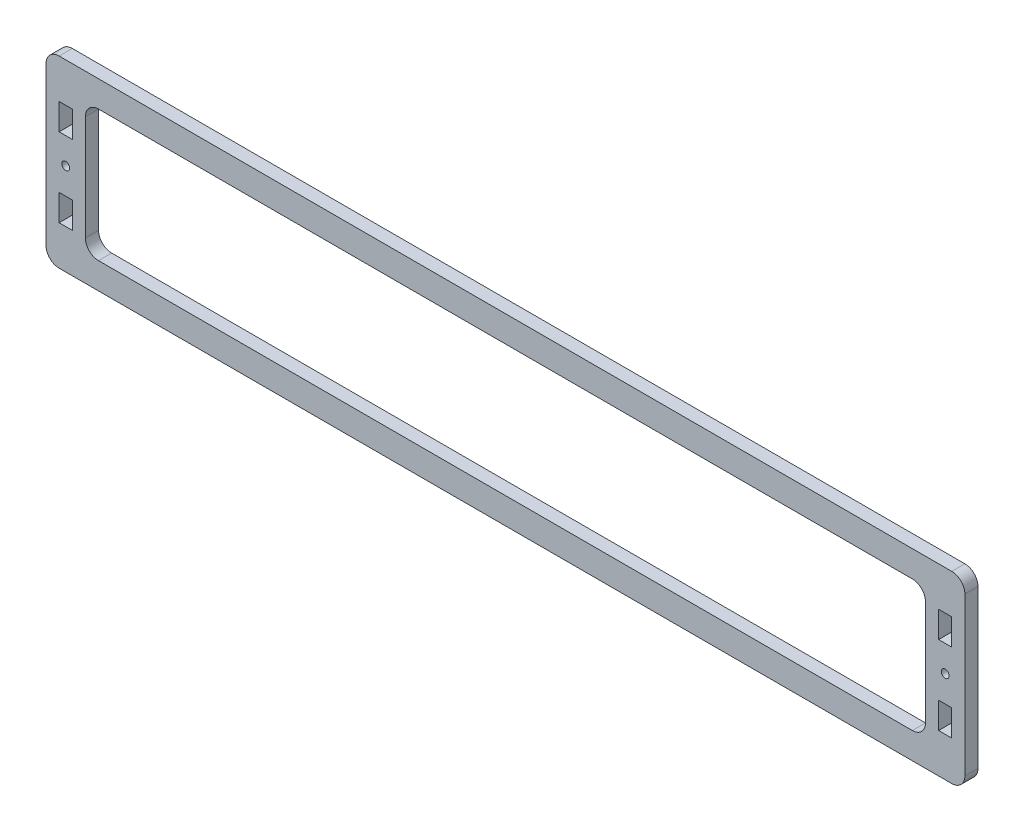
ISO-10303-21;
HEADER;
FILE_DESCRIPTION(('STEP AP214'),'2;1');
FILE_NAME('part.step','',(''),(''),'','','');
FILE_SCHEMA(('AUTOMOTIVE_DESIGN { 1 0 10303 214 1 1 1 1 }'));
ENDSEC;
DATA;
#1=APPLICATION_CONTEXT('core data for automotive mechanical design processes');
#2=APPLICATION_PROTOCOL_DEFINITION('international standard','automotive_design',2000,#1);
#3=PRODUCT_CONTEXT('',#1,'mechanical');
#4=PRODUCT('Part','Part','',(#3));
#5=PRODUCT_RELATED_PRODUCT_CATEGORY('part','',(#4));
#6=PRODUCT_DEFINITION_FORMATION('','',#4);
#7=PRODUCT_DEFINITION_CONTEXT('part definition',#1,'design');
#8=PRODUCT_DEFINITION('design','',#6,#7);
#9=PRODUCT_DEFINITION_SHAPE('','',#8);
#10=(LENGTH_UNIT() NAMED_UNIT(*) SI_UNIT(.MILLI.,.METRE.));
#11=(NAMED_UNIT(*) PLANE_ANGLE_UNIT() SI_UNIT($,.RADIAN.));
#12=(NAMED_UNIT(*) SI_UNIT($,.STERADIAN.) SOLID_ANGLE_UNIT());
#13=UNCERTAINTY_MEASURE_WITH_UNIT(LENGTH_MEASURE(1.E-05),#10,'distance_accuracy_value','');
#14=(GEOMETRIC_REPRESENTATION_CONTEXT(3) GLOBAL_UNCERTAINTY_ASSIGNED_CONTEXT((#13)) GLOBAL_UNIT_ASSIGNED_CONTEXT((#10,
#11,#12)) REPRESENTATION_CONTEXT('',''));
#15=CARTESIAN_POINT('',(0.,0.,0.));
#16=DIRECTION('',(0.,0.,1.));
#17=DIRECTION('',(1.,0.,0.));
#18=AXIS2_PLACEMENT_3D('',#15,#16,#17);
#19=CARTESIAN_POINT('',(0.,0.,5.));
#20=DIRECTION('',(0.,0.,1.));
#21=DIRECTION('',(1.,0.,0.));
#22=AXIS2_PLACEMENT_3D('',#19,#20,#21);
#23=PLANE('',#22);
#24=DIRECTION('',(0.,-1.,0.));
#25=VECTOR('',#24,1.);
#26=CARTESIAN_POINT('',(-70.8132530120482,25.,5.));
#27=LINE('',#26,#25);
#28=CARTESIAN_POINT('',(-70.8132530120482,20.,5.));
#29=VERTEX_POINT('',#28);
#30=CARTESIAN_POINT('',(-70.8132530120482,-20.,5.));
#31=VERTEX_POINT('',#30);
#32=EDGE_CURVE('E524',#29,#31,#27,.T.);
#33=ORIENTED_EDGE('',*,*,#32,.F.);
#34=CARTESIAN_POINT('',(-65.8132530120482,20.,5.));
#35=DIRECTION('',(0.,0.,1.));
#36=DIRECTION('',(1.,0.,0.));
#37=AXIS2_PLACEMENT_3D('',#34,#35,#36);
#38=CIRCLE('',#37,5.);
#39=CARTESIAN_POINT('',(-65.8132530120482,25.,5.));
#40=VERTEX_POINT('',#39);
#41=EDGE_CURVE('E486',#29,#40,#38,.F.);
#42=ORIENTED_EDGE('',*,*,#41,.T.);
#43=DIRECTION('',(-1.,0.,0.));
#44=VECTOR('',#43,1.);
#45=CARTESIAN_POINT('',(-70.8132530120482,25.,5.));
#46=LINE('',#45,#44);
#47=CARTESIAN_POINT('',(244.186746987952,25.,5.));
#48=VERTEX_POINT('',#47);
#49=EDGE_CURVE('E276',#48,#40,#46,.T.);
#50=ORIENTED_EDGE('',*,*,#49,.F.);
#51=CARTESIAN_POINT('',(244.186746987952,20.,5.));
#52=DIRECTION('',(0.,0.,1.));
#53=DIRECTION('',(1.,0.,0.));
#54=AXIS2_PLACEMENT_3D('',#51,#52,#53);
#55=CIRCLE('',#54,5.);
#56=CARTESIAN_POINT('',(249.186746987952,20.,5.));
#57=VERTEX_POINT('',#56);
#58=EDGE_CURVE('E41',#48,#57,#55,.F.);
#59=ORIENTED_EDGE('',*,*,#58,.T.);
#60=DIRECTION('',(0.,1.,0.));
#61=VECTOR('',#60,1.);
#62=CARTESIAN_POINT('',(249.186746987952,25.,5.));
#63=LINE('',#62,#61);
#64=CARTESIAN_POINT('',(249.186746987952,-20.,5.));
#65=VERTEX_POINT('',#64);
#66=EDGE_CURVE('E495',#65,#57,#63,.T.);
#67=ORIENTED_EDGE('',*,*,#66,.F.);
#68=CARTESIAN_POINT('',(244.186746987952,-20.,5.));
#69=DIRECTION('',(0.,0.,1.));
#70=DIRECTION('',(1.,0.,0.));
#71=AXIS2_PLACEMENT_3D('',#68,#69,#70);
#72=CIRCLE('',#71,5.);
#73=CARTESIAN_POINT('',(244.186746987952,-25.,5.));
#74=VERTEX_POINT('',#73);
#75=EDGE_CURVE('E478',#65,#74,#72,.F.);
#76=ORIENTED_EDGE('',*,*,#75,.T.);
#77=DIRECTION('',(1.,0.,0.));
#78=VECTOR('',#77,1.);
#79=CARTESIAN_POINT('',(-70.8132530120482,-25.,5.));
#80=LINE('',#79,#78);
#81=CARTESIAN_POINT('',(-65.8132530120482,-25.,5.));
#82=VERTEX_POINT('',#81);
#83=EDGE_CURVE('E504',#82,#74,#80,.T.);
#84=ORIENTED_EDGE('',*,*,#83,.F.);
#85=CARTESIAN_POINT('',(-65.8132530120482,-20.,5.));
#86=DIRECTION('',(0.,0.,1.));
#87=DIRECTION('',(1.,0.,0.));
#88=AXIS2_PLACEMENT_3D('',#85,#86,#87);
#89=CIRCLE('',#88,5.);
#90=EDGE_CURVE('E482',#82,#31,#89,.F.);
#91=ORIENTED_EDGE('',*,*,#90,.T.);
#92=EDGE_LOOP('',(#33,#42,#50,#59,#67,#76,#84,#91));
#93=FACE_BOUND('',#92,.T.);
#94=DIRECTION('',(0.,1.,0.));
#95=VECTOR('',#94,1.);
#96=CARTESIAN_POINT('',(259.186746987952,-20.,5.));
#97=LINE('',#96,#95);
#98=CARTESIAN_POINT('',(259.186746987952,-20.,5.));
#99=VERTEX_POINT('',#98);
#100=CARTESIAN_POINT('',(259.186746987952,-10.,5.));
#101=VERTEX_POINT('',#100);
#102=EDGE_CURVE('E295',#99,#101,#97,.T.);
#103=ORIENTED_EDGE('',*,*,#102,.F.);
#104=DIRECTION('',(1.,0.,0.));
#105=VECTOR('',#104,1.);
#106=CARTESIAN_POINT('',(259.186746987952,-20.,5.));
#107=LINE('',#106,#105);
#108=CARTESIAN_POINT('',(254.186746987952,-20.,5.));
#109=VERTEX_POINT('',#108);
#110=EDGE_CURVE('E293',#109,#99,#107,.T.);
#111=ORIENTED_EDGE('',*,*,#110,.F.);
#112=DIRECTION('',(0.,-1.,0.));
#113=VECTOR('',#112,1.);
#114=CARTESIAN_POINT('',(254.186746987952,-20.,5.));
#115=LINE('',#114,#113);
#116=CARTESIAN_POINT('',(254.186746987952,-9.99999999999996,5.));
#117=VERTEX_POINT('',#116);
#118=EDGE_CURVE('E301',#117,#109,#115,.T.);
#119=ORIENTED_EDGE('',*,*,#118,.F.);
#120=DIRECTION('',(-1.,0.,0.));
#121=VECTOR('',#120,1.);
#122=CARTESIAN_POINT('',(259.186746987952,-10.,5.));
#123=LINE('',#122,#121);
#124=EDGE_CURVE('E298',#101,#117,#123,.T.);
#125=ORIENTED_EDGE('',*,*,#124,.F.);
#126=EDGE_LOOP('',(#103,#111,#119,#125));
#127=FACE_BOUND('',#126,.T.);
#128=CARTESIAN_POINT('',(-78.3132530120482,0.,5.));
#129=DIRECTION('',(0.,0.,1.));
#130=DIRECTION('',(1.,0.,0.));
#131=AXIS2_PLACEMENT_3D('',#128,#129,#130);
#132=CIRCLE('',#131,1.5);
#133=CARTESIAN_POINT('',(-76.8132530120482,0.,5.));
#134=VERTEX_POINT('',#133);
#135=EDGE_CURVE('E324',#134,#134,#132,.T.);
#136=ORIENTED_EDGE('',*,*,#135,.F.);
#137=EDGE_LOOP('',(#136));
#138=FACE_BOUND('',#137,.T.);
#139=DIRECTION('',(0.,-1.,0.));
#140=VECTOR('',#139,1.);
#141=CARTESIAN_POINT('',(-85.8132530120482,35.,5.));
#142=LINE('',#141,#140);
#143=CARTESIAN_POINT('',(-85.8132530120482,30.,5.));
#144=VERTEX_POINT('',#143);
#145=CARTESIAN_POINT('',(-85.8132530120482,-30.,5.));
#146=VERTEX_POINT('',#145);
#147=EDGE_CURVE('E392',#144,#146,#142,.T.);
#148=ORIENTED_EDGE('',*,*,#147,.T.);
#149=CARTESIAN_POINT('',(-80.8132530120482,-30.,5.));
#150=DIRECTION('',(0.,0.,1.));
#151=DIRECTION('',(1.,0.,0.));
#152=AXIS2_PLACEMENT_3D('',#149,#150,#151);
#153=CIRCLE('',#152,5.);
#154=CARTESIAN_POINT('',(-80.8132530120482,-35.,5.));
#155=VERTEX_POINT('',#154);
#156=EDGE_CURVE('E447',#146,#155,#153,.T.);
#157=ORIENTED_EDGE('',*,*,#156,.T.);
#158=DIRECTION('',(1.,0.,0.));
#159=VECTOR('',#158,1.);
#160=CARTESIAN_POINT('',(-85.8132530120482,-35.,5.));
#161=LINE('',#160,#159);
#162=CARTESIAN_POINT('',(259.186746987952,-35.,5.));
#163=VERTEX_POINT('',#162);
#164=EDGE_CURVE('E395',#155,#163,#161,.T.);
#165=ORIENTED_EDGE('',*,*,#164,.T.);
#166=CARTESIAN_POINT('',(259.186746987952,-30.,5.));
#167=DIRECTION('',(0.,0.,1.));
#168=DIRECTION('',(1.,0.,0.));
#169=AXIS2_PLACEMENT_3D('',#166,#167,#168);
#170=CIRCLE('',#169,5.);
#171=CARTESIAN_POINT('',(264.186746987952,-30.,5.));
#172=VERTEX_POINT('',#171);
#173=EDGE_CURVE('E444',#163,#172,#170,.T.);
#174=ORIENTED_EDGE('',*,*,#173,.T.);
#175=DIRECTION('',(0.,1.,0.));
#176=VECTOR('',#175,1.);
#177=CARTESIAN_POINT('',(264.186746987952,35.,5.));
#178=LINE('',#177,#176);
#179=CARTESIAN_POINT('',(264.186746987952,30.,5.));
#180=VERTEX_POINT('',#179);
#181=EDGE_CURVE('E399',#172,#180,#178,.T.);
#182=ORIENTED_EDGE('',*,*,#181,.T.);
#183=CARTESIAN_POINT('',(259.186746987952,30.,5.));
#184=DIRECTION('',(0.,0.,1.));
#185=DIRECTION('',(1.,0.,0.));
#186=AXIS2_PLACEMENT_3D('',#183,#184,#185);
#187=CIRCLE('',#186,5.);
#188=CARTESIAN_POINT('',(259.186746987952,35.,5.));
#189=VERTEX_POINT('',#188);
#190=EDGE_CURVE('E55',#180,#189,#187,.T.);
#191=ORIENTED_EDGE('',*,*,#190,.T.);
#192=DIRECTION('',(-1.,0.,0.));
#193=VECTOR('',#192,1.);
#194=CARTESIAN_POINT('',(-85.8132530120482,35.,5.));
#195=LINE('',#194,#193);
#196=CARTESIAN_POINT('',(-80.8132530120482,35.,5.));
#197=VERTEX_POINT('',#196);
#198=EDGE_CURVE('E401',#189,#197,#195,.T.);
#199=ORIENTED_EDGE('',*,*,#198,.T.);
#200=CARTESIAN_POINT('',(-80.8132530120482,30.,5.));
#201=DIRECTION('',(0.,0.,1.));
#202=DIRECTION('',(1.,0.,0.));
#203=AXIS2_PLACEMENT_3D('',#200,#201,#202);
#204=CIRCLE('',#203,5.);
#205=EDGE_CURVE('E442',#197,#144,#204,.T.);
#206=ORIENTED_EDGE('',*,*,#205,.T.);
#207=EDGE_LOOP('',(#148,#157,#165,#174,#182,#191,#199,#206));
#208=FACE_BOUND('',#207,.T.);
#209=DIRECTION('',(1.,0.,0.));
#210=VECTOR('',#209,1.);
#211=CARTESIAN_POINT('',(-80.8132530120482,10.,5.));
#212=LINE('',#211,#210);
#213=CARTESIAN_POINT('',(-80.8132530120482,10.,5.));
#214=VERTEX_POINT('',#213);
#215=CARTESIAN_POINT('',(-75.8132530120482,10.,5.));
#216=VERTEX_POINT('',#215);
#217=EDGE_CURVE('E363',#214,#216,#212,.T.);
#218=ORIENTED_EDGE('',*,*,#217,.F.);
#219=DIRECTION('',(0.,-1.,0.));
#220=VECTOR('',#219,1.);
#221=CARTESIAN_POINT('',(-80.8132530120482,20.,5.));
#222=LINE('',#221,#220);
#223=CARTESIAN_POINT('',(-80.8132530120482,20.,5.));
#224=VERTEX_POINT('',#223);
#225=EDGE_CURVE('E361',#224,#214,#222,.T.);
#226=ORIENTED_EDGE('',*,*,#225,.F.);
#227=DIRECTION('',(-1.,0.,0.));
#228=VECTOR('',#227,1.);
#229=CARTESIAN_POINT('',(-80.8132530120482,20.,5.));
#230=LINE('',#229,#228);
#231=CARTESIAN_POINT('',(-75.8132530120482,20.,5.));
#232=VERTEX_POINT('',#231);
#233=EDGE_CURVE('E369',#232,#224,#230,.T.);
#234=ORIENTED_EDGE('',*,*,#233,.F.);
#235=DIRECTION('',(0.,1.,0.));
#236=VECTOR('',#235,1.);
#237=CARTESIAN_POINT('',(-75.8132530120482,20.,5.));
#238=LINE('',#237,#236);
#239=EDGE_CURVE('E366',#216,#232,#238,.T.);
#240=ORIENTED_EDGE('',*,*,#239,.F.);
#241=EDGE_LOOP('',(#218,#226,#234,#240));
#242=FACE_BOUND('',#241,.T.);
#243=DIRECTION('',(1.,0.,0.));
#244=VECTOR('',#243,1.);
#245=CARTESIAN_POINT('',(-80.8132530120482,-20.,5.));
#246=LINE('',#245,#244);
#247=CARTESIAN_POINT('',(-80.8132530120482,-20.,5.));
#248=VERTEX_POINT('',#247);
#249=CARTESIAN_POINT('',(-75.8132530120482,-20.,5.));
#250=VERTEX_POINT('',#249);
#251=EDGE_CURVE('E332',#248,#250,#246,.T.);
#252=ORIENTED_EDGE('',*,*,#251,.F.);
#253=DIRECTION('',(0.,-1.,0.));
#254=VECTOR('',#253,1.);
#255=CARTESIAN_POINT('',(-80.8132530120482,-20.,5.));
#256=LINE('',#255,#254);
#257=CARTESIAN_POINT('',(-80.8132530120482,-10.,5.));
#258=VERTEX_POINT('',#257);
#259=EDGE_CURVE('E330',#258,#248,#256,.T.);
#260=ORIENTED_EDGE('',*,*,#259,.F.);
#261=DIRECTION('',(-1.,0.,0.));
#262=VECTOR('',#261,1.);
#263=CARTESIAN_POINT('',(-80.8132530120482,-10.,5.));
#264=LINE('',#263,#262);
#265=CARTESIAN_POINT('',(-75.8132530120482,-10.,5.));
#266=VERTEX_POINT('',#265);
#267=EDGE_CURVE('E338',#266,#258,#264,.T.);
#268=ORIENTED_EDGE('',*,*,#267,.F.);
#269=DIRECTION('',(0.,1.,0.));
#270=VECTOR('',#269,1.);
#271=CARTESIAN_POINT('',(-75.8132530120482,-20.,5.));
#272=LINE('',#271,#270);
#273=EDGE_CURVE('E335',#250,#266,#272,.T.);
#274=ORIENTED_EDGE('',*,*,#273,.F.);
#275=EDGE_LOOP('',(#252,#260,#268,#274));
#276=FACE_BOUND('',#275,.T.);
#277=CARTESIAN_POINT('',(256.686746987952,0.,5.));
#278=DIRECTION('',(0.,0.,1.));
#279=DIRECTION('',(-1.,0.,0.));
#280=AXIS2_PLACEMENT_3D('',#277,#278,#279);
#281=CIRCLE('',#280,1.50000000000008);
#282=CARTESIAN_POINT('',(255.186746987952,0.,5.));
#283=VERTEX_POINT('',#282);
#284=EDGE_CURVE('E287',#283,#283,#281,.T.);
#285=ORIENTED_EDGE('',*,*,#284,.F.);
#286=EDGE_LOOP('',(#285));
#287=FACE_BOUND('',#286,.T.);
#288=DIRECTION('',(-1.,0.,0.));
#289=VECTOR('',#288,1.);
#290=CARTESIAN_POINT('',(259.186746987952,20.,5.));
#291=LINE('',#290,#289);
#292=CARTESIAN_POINT('',(259.186746987952,20.,5.));
#293=VERTEX_POINT('',#292);
#294=CARTESIAN_POINT('',(254.186746987952,20.,5.));
#295=VERTEX_POINT('',#294);
#296=EDGE_CURVE('E254',#293,#295,#291,.T.);
#297=ORIENTED_EDGE('',*,*,#296,.F.);
#298=DIRECTION('',(0.,1.,0.));
#299=VECTOR('',#298,1.);
#300=CARTESIAN_POINT('',(259.186746987952,20.,5.));
#301=LINE('',#300,#299);
#302=CARTESIAN_POINT('',(259.186746987952,10.,5.));
#303=VERTEX_POINT('',#302);
#304=EDGE_CURVE('E244',#303,#293,#301,.T.);
#305=ORIENTED_EDGE('',*,*,#304,.F.);
#306=DIRECTION('',(1.,0.,0.));
#307=VECTOR('',#306,1.);
#308=CARTESIAN_POINT('',(259.186746987952,10.,5.));
#309=LINE('',#308,#307);
#310=CARTESIAN_POINT('',(254.186746987952,9.99999999999996,5.));
#311=VERTEX_POINT('',#310);
#312=EDGE_CURVE('E269',#311,#303,#309,.T.);
#313=ORIENTED_EDGE('',*,*,#312,.F.);
#314=DIRECTION('',(0.,-1.,0.));
#315=VECTOR('',#314,1.);
#316=CARTESIAN_POINT('',(254.186746987952,20.,5.));
#317=LINE('',#316,#315);
#318=EDGE_CURVE('E267',#295,#311,#317,.T.);
#319=ORIENTED_EDGE('',*,*,#318,.F.);
#320=EDGE_LOOP('',(#297,#305,#313,#319));
#321=FACE_BOUND('',#320,.T.);
#322=ADVANCED_FACE('F33',(#93,#127,#138,#208,#242,#276,#287,#321),#23,.T.);
#323=CARTESIAN_POINT('',(0.,0.,0.));
#324=DIRECTION('',(0.,0.,1.));
#325=DIRECTION('',(1.,0.,0.));
#326=AXIS2_PLACEMENT_3D('',#323,#324,#325);
#327=PLANE('',#326);
#328=DIRECTION('',(0.,1.,0.));
#329=VECTOR('',#328,1.);
#330=CARTESIAN_POINT('',(249.186746987952,0.,0.));
#331=LINE('',#330,#329);
#332=CARTESIAN_POINT('',(249.186746987952,-20.,0.));
#333=VERTEX_POINT('',#332);
#334=CARTESIAN_POINT('',(249.186746987952,20.,0.));
#335=VERTEX_POINT('',#334);
#336=EDGE_CURVE('E415',#333,#335,#331,.T.);
#337=ORIENTED_EDGE('',*,*,#336,.T.);
#338=CARTESIAN_POINT('',(244.186746987952,20.,0.));
#339=DIRECTION('',(0.,0.,1.));
#340=DIRECTION('',(1.,0.,0.));
#341=AXIS2_PLACEMENT_3D('',#338,#339,#340);
#342=CIRCLE('',#341,5.);
#343=CARTESIAN_POINT('',(244.186746987952,25.,0.));
#344=VERTEX_POINT('',#343);
#345=EDGE_CURVE('E11',#335,#344,#342,.T.);
#346=ORIENTED_EDGE('',*,*,#345,.T.);
#347=DIRECTION('',(-1.,0.,0.));
#348=VECTOR('',#347,1.);
#349=CARTESIAN_POINT('',(0.,25.,0.));
#350=LINE('',#349,#348);
#351=CARTESIAN_POINT('',(-65.8132530120482,25.,0.));
#352=VERTEX_POINT('',#351);
#353=EDGE_CURVE('E418',#344,#352,#350,.T.);
#354=ORIENTED_EDGE('',*,*,#353,.T.);
#355=CARTESIAN_POINT('',(-65.8132530120482,20.,0.));
#356=DIRECTION('',(0.,0.,1.));
#357=DIRECTION('',(1.,0.,0.));
#358=AXIS2_PLACEMENT_3D('',#355,#356,#357);
#359=CIRCLE('',#358,5.);
#360=CARTESIAN_POINT('',(-70.8132530120482,20.,0.));
#361=VERTEX_POINT('',#360);
#362=EDGE_CURVE('E488',#352,#361,#359,.T.);
#363=ORIENTED_EDGE('',*,*,#362,.T.);
#364=DIRECTION('',(0.,-1.,0.));
#365=VECTOR('',#364,1.);
#366=CARTESIAN_POINT('',(-70.8132530120482,0.,0.));
#367=LINE('',#366,#365);
#368=CARTESIAN_POINT('',(-70.8132530120482,-20.,0.));
#369=VERTEX_POINT('',#368);
#370=EDGE_CURVE('E421',#361,#369,#367,.T.);
#371=ORIENTED_EDGE('',*,*,#370,.T.);
#372=CARTESIAN_POINT('',(-65.8132530120482,-20.,0.));
#373=DIRECTION('',(0.,0.,1.));
#374=DIRECTION('',(1.,0.,0.));
#375=AXIS2_PLACEMENT_3D('',#372,#373,#374);
#376=CIRCLE('',#375,5.);
#377=CARTESIAN_POINT('',(-65.8132530120482,-25.,0.));
#378=VERTEX_POINT('',#377);
#379=EDGE_CURVE('E484',#369,#378,#376,.T.);
#380=ORIENTED_EDGE('',*,*,#379,.T.);
#381=DIRECTION('',(1.,0.,0.));
#382=VECTOR('',#381,1.);
#383=CARTESIAN_POINT('',(0.,-25.,0.));
#384=LINE('',#383,#382);
#385=CARTESIAN_POINT('',(244.186746987952,-25.,0.));
#386=VERTEX_POINT('',#385);
#387=EDGE_CURVE('E403',#378,#386,#384,.T.);
#388=ORIENTED_EDGE('',*,*,#387,.T.);
#389=CARTESIAN_POINT('',(244.186746987952,-20.,0.));
#390=DIRECTION('',(0.,0.,1.));
#391=DIRECTION('',(1.,0.,0.));
#392=AXIS2_PLACEMENT_3D('',#389,#390,#391);
#393=CIRCLE('',#392,5.);
#394=EDGE_CURVE('E480',#386,#333,#393,.T.);
#395=ORIENTED_EDGE('',*,*,#394,.T.);
#396=EDGE_LOOP('',(#337,#346,#354,#363,#371,#380,#388,#395));
#397=FACE_BOUND('',#396,.T.);
#398=CARTESIAN_POINT('',(256.686746987952,0.,0.));
#399=DIRECTION('',(0.,0.,1.));
#400=DIRECTION('',(-1.,0.,0.));
#401=AXIS2_PLACEMENT_3D('',#398,#399,#400);
#402=CIRCLE('',#401,1.50000000000008);
#403=CARTESIAN_POINT('',(255.186746987952,0.,0.));
#404=VERTEX_POINT('',#403);
#405=EDGE_CURVE('E262',#404,#404,#402,.T.);
#406=ORIENTED_EDGE('',*,*,#405,.T.);
#407=EDGE_LOOP('',(#406));
#408=FACE_BOUND('',#407,.T.);
#409=DIRECTION('',(1.,0.,0.));
#410=VECTOR('',#409,1.);
#411=CARTESIAN_POINT('',(259.186746987952,-20.,0.));
#412=LINE('',#411,#410);
#413=CARTESIAN_POINT('',(254.186746987952,-20.,0.));
#414=VERTEX_POINT('',#413);
#415=CARTESIAN_POINT('',(259.186746987952,-20.,0.));
#416=VERTEX_POINT('',#415);
#417=EDGE_CURVE('E290',#414,#416,#412,.T.);
#418=ORIENTED_EDGE('',*,*,#417,.T.);
#419=DIRECTION('',(0.,1.,0.));
#420=VECTOR('',#419,1.);
#421=CARTESIAN_POINT('',(259.186746987952,-20.,0.));
#422=LINE('',#421,#420);
#423=CARTESIAN_POINT('',(259.186746987952,-10.,0.));
#424=VERTEX_POINT('',#423);
#425=EDGE_CURVE('E306',#416,#424,#422,.T.);
#426=ORIENTED_EDGE('',*,*,#425,.T.);
#427=DIRECTION('',(-1.,0.,0.));
#428=VECTOR('',#427,1.);
#429=CARTESIAN_POINT('',(259.186746987952,-10.,0.));
#430=LINE('',#429,#428);
#431=CARTESIAN_POINT('',(254.186746987952,-9.99999999999996,0.));
#432=VERTEX_POINT('',#431);
#433=EDGE_CURVE('E309',#424,#432,#430,.T.);
#434=ORIENTED_EDGE('',*,*,#433,.T.);
#435=DIRECTION('',(0.,-1.,0.));
#436=VECTOR('',#435,1.);
#437=CARTESIAN_POINT('',(254.186746987952,-20.,0.));
#438=LINE('',#437,#436);
#439=EDGE_CURVE('E296',#432,#414,#438,.T.);
#440=ORIENTED_EDGE('',*,*,#439,.T.);
#441=EDGE_LOOP('',(#418,#426,#434,#440));
#442=FACE_BOUND('',#441,.T.);
#443=DIRECTION('',(0.,-1.,0.));
#444=VECTOR('',#443,1.);
#445=CARTESIAN_POINT('',(-80.8132530120482,20.,0.));
#446=LINE('',#445,#444);
#447=CARTESIAN_POINT('',(-80.8132530120482,20.,0.));
#448=VERTEX_POINT('',#447);
#449=CARTESIAN_POINT('',(-80.8132530120482,10.,0.));
#450=VERTEX_POINT('',#449);
#451=EDGE_CURVE('E360',#448,#450,#446,.T.);
#452=ORIENTED_EDGE('',*,*,#451,.T.);
#453=DIRECTION('',(1.,0.,0.));
#454=VECTOR('',#453,1.);
#455=CARTESIAN_POINT('',(-80.8132530120482,10.,0.));
#456=LINE('',#455,#454);
#457=CARTESIAN_POINT('',(-75.8132530120482,10.,0.));
#458=VERTEX_POINT('',#457);
#459=EDGE_CURVE('E374',#450,#458,#456,.T.);
#460=ORIENTED_EDGE('',*,*,#459,.T.);
#461=DIRECTION('',(0.,1.,0.));
#462=VECTOR('',#461,1.);
#463=CARTESIAN_POINT('',(-75.8132530120482,20.,0.));
#464=LINE('',#463,#462);
#465=CARTESIAN_POINT('',(-75.8132530120482,20.,0.));
#466=VERTEX_POINT('',#465);
#467=EDGE_CURVE('E377',#458,#466,#464,.T.);
#468=ORIENTED_EDGE('',*,*,#467,.T.);
#469=DIRECTION('',(-1.,0.,0.));
#470=VECTOR('',#469,1.);
#471=CARTESIAN_POINT('',(-80.8132530120482,20.,0.));
#472=LINE('',#471,#470);
#473=EDGE_CURVE('E364',#466,#448,#472,.T.);
#474=ORIENTED_EDGE('',*,*,#473,.T.);
#475=EDGE_LOOP('',(#452,#460,#468,#474));
#476=FACE_BOUND('',#475,.T.);
#477=DIRECTION('',(1.,0.,0.));
#478=VECTOR('',#477,1.);
#479=CARTESIAN_POINT('',(-85.8132530120482,-35.,0.));
#480=LINE('',#479,#478);
#481=CARTESIAN_POINT('',(-80.8132530120482,-35.,0.));
#482=VERTEX_POINT('',#481);
#483=CARTESIAN_POINT('',(259.186746987952,-35.,0.));
#484=VERTEX_POINT('',#483);
#485=EDGE_CURVE('E406',#482,#484,#480,.T.);
#486=ORIENTED_EDGE('',*,*,#485,.F.);
#487=CARTESIAN_POINT('',(-80.8132530120482,-30.,0.));
#488=DIRECTION('',(0.,0.,1.));
#489=DIRECTION('',(1.,0.,0.));
#490=AXIS2_PLACEMENT_3D('',#487,#488,#489);
#491=CIRCLE('',#490,5.);
#492=CARTESIAN_POINT('',(-85.8132530120482,-30.,0.));
#493=VERTEX_POINT('',#492);
#494=EDGE_CURVE('E435',#482,#493,#491,.F.);
#495=ORIENTED_EDGE('',*,*,#494,.T.);
#496=DIRECTION('',(0.,-1.,0.));
#497=VECTOR('',#496,1.);
#498=CARTESIAN_POINT('',(-85.8132530120482,35.,0.));
#499=LINE('',#498,#497);
#500=CARTESIAN_POINT('',(-85.8132530120482,30.,0.));
#501=VERTEX_POINT('',#500);
#502=EDGE_CURVE('E391',#501,#493,#499,.T.);
#503=ORIENTED_EDGE('',*,*,#502,.F.);
#504=CARTESIAN_POINT('',(-80.8132530120482,30.,0.));
#505=DIRECTION('',(0.,0.,1.));
#506=DIRECTION('',(1.,0.,0.));
#507=AXIS2_PLACEMENT_3D('',#504,#505,#506);
#508=CIRCLE('',#507,5.);
#509=CARTESIAN_POINT('',(-80.8132530120482,35.,0.));
#510=VERTEX_POINT('',#509);
#511=EDGE_CURVE('E429',#501,#510,#508,.F.);
#512=ORIENTED_EDGE('',*,*,#511,.T.);
#513=DIRECTION('',(-1.,0.,0.));
#514=VECTOR('',#513,1.);
#515=CARTESIAN_POINT('',(-85.8132530120482,35.,0.));
#516=LINE('',#515,#514);
#517=CARTESIAN_POINT('',(259.186746987952,35.,0.));
#518=VERTEX_POINT('',#517);
#519=EDGE_CURVE('E396',#518,#510,#516,.T.);
#520=ORIENTED_EDGE('',*,*,#519,.F.);
#521=CARTESIAN_POINT('',(259.186746987952,30.,0.));
#522=DIRECTION('',(0.,0.,1.));
#523=DIRECTION('',(1.,0.,0.));
#524=AXIS2_PLACEMENT_3D('',#521,#522,#523);
#525=CIRCLE('',#524,5.);
#526=CARTESIAN_POINT('',(264.186746987952,30.,0.));
#527=VERTEX_POINT('',#526);
#528=EDGE_CURVE('E433',#518,#527,#525,.F.);
#529=ORIENTED_EDGE('',*,*,#528,.T.);
#530=DIRECTION('',(0.,1.,0.));
#531=VECTOR('',#530,1.);
#532=CARTESIAN_POINT('',(264.186746987952,35.,0.));
#533=LINE('',#532,#531);
#534=CARTESIAN_POINT('',(264.186746987952,-30.,0.));
#535=VERTEX_POINT('',#534);
#536=EDGE_CURVE('E409',#535,#527,#533,.T.);
#537=ORIENTED_EDGE('',*,*,#536,.F.);
#538=CARTESIAN_POINT('',(259.186746987952,-30.,0.));
#539=DIRECTION('',(0.,0.,1.));
#540=DIRECTION('',(1.,0.,0.));
#541=AXIS2_PLACEMENT_3D('',#538,#539,#540);
#542=CIRCLE('',#541,5.);
#543=EDGE_CURVE('E431',#535,#484,#542,.F.);
#544=ORIENTED_EDGE('',*,*,#543,.T.);
#545=EDGE_LOOP('',(#486,#495,#503,#512,#520,#529,#537,#544));
#546=FACE_BOUND('',#545,.T.);
#547=DIRECTION('',(0.,-1.,0.));
#548=VECTOR('',#547,1.);
#549=CARTESIAN_POINT('',(-80.8132530120482,-20.,0.));
#550=LINE('',#549,#548);
#551=CARTESIAN_POINT('',(-80.8132530120482,-10.,0.));
#552=VERTEX_POINT('',#551);
#553=CARTESIAN_POINT('',(-80.8132530120482,-20.,0.));
#554=VERTEX_POINT('',#553);
#555=EDGE_CURVE('E327',#552,#554,#550,.T.);
#556=ORIENTED_EDGE('',*,*,#555,.T.);
#557=DIRECTION('',(1.,0.,0.));
#558=VECTOR('',#557,1.);
#559=CARTESIAN_POINT('',(-80.8132530120482,-20.,0.));
#560=LINE('',#559,#558);
#561=CARTESIAN_POINT('',(-75.8132530120482,-20.,0.));
#562=VERTEX_POINT('',#561);
#563=EDGE_CURVE('E343',#554,#562,#560,.T.);
#564=ORIENTED_EDGE('',*,*,#563,.T.);
#565=DIRECTION('',(0.,1.,0.));
#566=VECTOR('',#565,1.);
#567=CARTESIAN_POINT('',(-75.8132530120482,-20.,0.));
#568=LINE('',#567,#566);
#569=CARTESIAN_POINT('',(-75.8132530120482,-10.,0.));
#570=VERTEX_POINT('',#569);
#571=EDGE_CURVE('E346',#562,#570,#568,.T.);
#572=ORIENTED_EDGE('',*,*,#571,.T.);
#573=DIRECTION('',(-1.,0.,0.));
#574=VECTOR('',#573,1.);
#575=CARTESIAN_POINT('',(-80.8132530120482,-10.,0.));
#576=LINE('',#575,#574);
#577=EDGE_CURVE('E333',#570,#552,#576,.T.);
#578=ORIENTED_EDGE('',*,*,#577,.T.);
#579=EDGE_LOOP('',(#556,#564,#572,#578));
#580=FACE_BOUND('',#579,.T.);
#581=CARTESIAN_POINT('',(-78.3132530120482,0.,0.));
#582=DIRECTION('',(0.,0.,1.));
#583=DIRECTION('',(1.,0.,0.));
#584=AXIS2_PLACEMENT_3D('',#581,#582,#583);
#585=CIRCLE('',#584,1.5);
#586=CARTESIAN_POINT('',(-76.8132530120482,0.,0.));
#587=VERTEX_POINT('',#586);
#588=EDGE_CURVE('E323',#587,#587,#585,.T.);
#589=ORIENTED_EDGE('',*,*,#588,.T.);
#590=EDGE_LOOP('',(#589));
#591=FACE_BOUND('',#590,.T.);
#592=DIRECTION('',(0.,1.,0.));
#593=VECTOR('',#592,1.);
#594=CARTESIAN_POINT('',(259.186746987952,20.,0.));
#595=LINE('',#594,#593);
#596=CARTESIAN_POINT('',(259.186746987952,10.,0.));
#597=VERTEX_POINT('',#596);
#598=CARTESIAN_POINT('',(259.186746987952,20.,0.));
#599=VERTEX_POINT('',#598);
#600=EDGE_CURVE('E274',#597,#599,#595,.T.);
#601=ORIENTED_EDGE('',*,*,#600,.T.);
#602=DIRECTION('',(-1.,0.,0.));
#603=VECTOR('',#602,1.);
#604=CARTESIAN_POINT('',(259.186746987952,20.,0.));
#605=LINE('',#604,#603);
#606=CARTESIAN_POINT('',(254.186746987952,20.,0.));
#607=VERTEX_POINT('',#606);
#608=EDGE_CURVE('E261',#599,#607,#605,.T.);
#609=ORIENTED_EDGE('',*,*,#608,.T.);
#610=DIRECTION('',(0.,-1.,0.));
#611=VECTOR('',#610,1.);
#612=CARTESIAN_POINT('',(254.186746987952,20.,0.));
#613=LINE('',#612,#611);
#614=CARTESIAN_POINT('',(254.186746987952,9.99999999999996,0.));
#615=VERTEX_POINT('',#614);
#616=EDGE_CURVE('E278',#607,#615,#613,.T.);
#617=ORIENTED_EDGE('',*,*,#616,.T.);
#618=DIRECTION('',(1.,0.,0.));
#619=VECTOR('',#618,1.);
#620=CARTESIAN_POINT('',(259.186746987952,10.,0.));
#621=LINE('',#620,#619);
#622=EDGE_CURVE('E255',#615,#597,#621,.T.);
#623=ORIENTED_EDGE('',*,*,#622,.T.);
#624=EDGE_LOOP('',(#601,#609,#617,#623));
#625=FACE_BOUND('',#624,.T.);
#626=ADVANCED_FACE('F509',(#397,#408,#442,#476,#546,#580,#591,#625),#327,.F.);
#627=CARTESIAN_POINT('',(-85.8132530120482,35.,5.));
#628=DIRECTION('',(1.,0.,0.));
#629=DIRECTION('',(0.,0.,-1.));
#630=AXIS2_PLACEMENT_3D('',#627,#628,#629);
#631=PLANE('',#630);
#632=ORIENTED_EDGE('',*,*,#502,.T.);
#633=DIRECTION('',(0.,0.,-1.));
#634=VECTOR('',#633,1.);
#635=CARTESIAN_POINT('',(-85.8132530120482,-30.,5.));
#636=LINE('',#635,#634);
#637=EDGE_CURVE('E440',#493,#146,#636,.F.);
#638=ORIENTED_EDGE('',*,*,#637,.T.);
#639=ORIENTED_EDGE('',*,*,#147,.F.);
#640=DIRECTION('',(0.,0.,-1.));
#641=VECTOR('',#640,1.);
#642=CARTESIAN_POINT('',(-85.8132530120482,30.,5.));
#643=LINE('',#642,#641);
#644=EDGE_CURVE('E437',#144,#501,#643,.T.);
#645=ORIENTED_EDGE('',*,*,#644,.T.);
#646=EDGE_LOOP('',(#632,#638,#639,#645));
#647=FACE_BOUND('',#646,.T.);
#648=ADVANCED_FACE('F555',(#647),#631,.F.);
#649=CARTESIAN_POINT('',(-85.8132530120482,-35.,5.));
#650=DIRECTION('',(0.,1.,0.));
#651=DIRECTION('',(-1.,0.,0.));
#652=AXIS2_PLACEMENT_3D('',#649,#650,#651);
#653=PLANE('',#652);
#654=ORIENTED_EDGE('',*,*,#164,.F.);
#655=DIRECTION('',(0.,0.,-1.));
#656=VECTOR('',#655,1.);
#657=CARTESIAN_POINT('',(-80.8132530120482,-35.,5.));
#658=LINE('',#657,#656);
#659=EDGE_CURVE('E426',#155,#482,#658,.T.);
#660=ORIENTED_EDGE('',*,*,#659,.T.);
#661=ORIENTED_EDGE('',*,*,#485,.T.);
#662=DIRECTION('',(0.,0.,-1.));
#663=VECTOR('',#662,1.);
#664=CARTESIAN_POINT('',(259.186746987952,-35.,5.));
#665=LINE('',#664,#663);
#666=EDGE_CURVE('E424',#484,#163,#665,.F.);
#667=ORIENTED_EDGE('',*,*,#666,.T.);
#668=EDGE_LOOP('',(#654,#660,#661,#667));
#669=FACE_BOUND('',#668,.T.);
#670=ADVANCED_FACE('F567',(#669),#653,.F.);
#671=CARTESIAN_POINT('',(264.186746987952,35.,5.));
#672=DIRECTION('',(-1.,0.,0.));
#673=DIRECTION('',(0.,0.,1.));
#674=AXIS2_PLACEMENT_3D('',#671,#672,#673);
#675=PLANE('',#674);
#676=ORIENTED_EDGE('',*,*,#536,.T.);
#677=DIRECTION('',(0.,0.,-1.));
#678=VECTOR('',#677,1.);
#679=CARTESIAN_POINT('',(264.186746987952,30.,5.));
#680=LINE('',#679,#678);
#681=EDGE_CURVE('E456',#527,#180,#680,.F.);
#682=ORIENTED_EDGE('',*,*,#681,.T.);
#683=ORIENTED_EDGE('',*,*,#181,.F.);
#684=DIRECTION('',(0.,0.,-1.));
#685=VECTOR('',#684,1.);
#686=CARTESIAN_POINT('',(264.186746987952,-30.,5.));
#687=LINE('',#686,#685);
#688=EDGE_CURVE('E453',#172,#535,#687,.T.);
#689=ORIENTED_EDGE('',*,*,#688,.T.);
#690=EDGE_LOOP('',(#676,#682,#683,#689));
#691=FACE_BOUND('',#690,.T.);
#692=ADVANCED_FACE('F564',(#691),#675,.F.);
#693=CARTESIAN_POINT('',(-85.8132530120482,35.,5.));
#694=DIRECTION('',(0.,-1.,0.));
#695=DIRECTION('',(1.,0.,0.));
#696=AXIS2_PLACEMENT_3D('',#693,#694,#695);
#697=PLANE('',#696);
#698=ORIENTED_EDGE('',*,*,#198,.F.);
#699=DIRECTION('',(0.,0.,-1.));
#700=VECTOR('',#699,1.);
#701=CARTESIAN_POINT('',(259.186746987952,35.,5.));
#702=LINE('',#701,#700);
#703=EDGE_CURVE('E450',#189,#518,#702,.T.);
#704=ORIENTED_EDGE('',*,*,#703,.T.);
#705=ORIENTED_EDGE('',*,*,#519,.T.);
#706=DIRECTION('',(0.,0.,-1.));
#707=VECTOR('',#706,1.);
#708=CARTESIAN_POINT('',(-80.8132530120482,35.,5.));
#709=LINE('',#708,#707);
#710=EDGE_CURVE('E48',#510,#197,#709,.F.);
#711=ORIENTED_EDGE('',*,*,#710,.T.);
#712=EDGE_LOOP('',(#698,#704,#705,#711));
#713=FACE_BOUND('',#712,.T.);
#714=ADVANCED_FACE('F561',(#713),#697,.F.);
#715=CARTESIAN_POINT('',(-80.8132530120482,20.,5.));
#716=DIRECTION('',(1.,0.,0.));
#717=DIRECTION('',(0.,0.,-1.));
#718=AXIS2_PLACEMENT_3D('',#715,#716,#717);
#719=PLANE('',#718);
#720=ORIENTED_EDGE('',*,*,#451,.F.);
#721=DIRECTION('',(0.,0.,-1.));
#722=VECTOR('',#721,1.);
#723=CARTESIAN_POINT('',(-80.8132530120482,20.,5.));
#724=LINE('',#723,#722);
#725=EDGE_CURVE('E371',#224,#448,#724,.T.);
#726=ORIENTED_EDGE('',*,*,#725,.F.);
#727=ORIENTED_EDGE('',*,*,#225,.T.);
#728=DIRECTION('',(0.,0.,-1.));
#729=VECTOR('',#728,1.);
#730=CARTESIAN_POINT('',(-80.8132530120482,10.,5.));
#731=LINE('',#730,#729);
#732=EDGE_CURVE('E388',#214,#450,#731,.T.);
#733=ORIENTED_EDGE('',*,*,#732,.T.);
#734=EDGE_LOOP('',(#720,#726,#727,#733));
#735=FACE_BOUND('',#734,.T.);
#736=ADVANCED_FACE('F558',(#735),#719,.T.);
#737=CARTESIAN_POINT('',(-80.8132530120482,10.,5.));
#738=DIRECTION('',(0.,1.,0.));
#739=DIRECTION('',(0.,0.,1.));
#740=AXIS2_PLACEMENT_3D('',#737,#738,#739);
#741=PLANE('',#740);
#742=ORIENTED_EDGE('',*,*,#459,.F.);
#743=ORIENTED_EDGE('',*,*,#732,.F.);
#744=ORIENTED_EDGE('',*,*,#217,.T.);
#745=DIRECTION('',(0.,0.,-1.));
#746=VECTOR('',#745,1.);
#747=CARTESIAN_POINT('',(-75.8132530120482,10.,5.));
#748=LINE('',#747,#746);
#749=EDGE_CURVE('E386',#216,#458,#748,.T.);
#750=ORIENTED_EDGE('',*,*,#749,.T.);
#751=EDGE_LOOP('',(#742,#743,#744,#750));
#752=FACE_BOUND('',#751,.T.);
#753=ADVANCED_FACE('F674',(#752),#741,.T.);
#754=CARTESIAN_POINT('',(-75.8132530120482,20.,5.));
#755=DIRECTION('',(-1.,0.,0.));
#756=DIRECTION('',(0.,0.,1.));
#757=AXIS2_PLACEMENT_3D('',#754,#755,#756);
#758=PLANE('',#757);
#759=ORIENTED_EDGE('',*,*,#467,.F.);
#760=ORIENTED_EDGE('',*,*,#749,.F.);
#761=ORIENTED_EDGE('',*,*,#239,.T.);
#762=DIRECTION('',(0.,0.,-1.));
#763=VECTOR('',#762,1.);
#764=CARTESIAN_POINT('',(-75.8132530120482,20.,5.));
#765=LINE('',#764,#763);
#766=EDGE_CURVE('E384',#232,#466,#765,.T.);
#767=ORIENTED_EDGE('',*,*,#766,.T.);
#768=EDGE_LOOP('',(#759,#760,#761,#767));
#769=FACE_BOUND('',#768,.T.);
#770=ADVANCED_FACE('F671',(#769),#758,.T.);
#771=CARTESIAN_POINT('',(-80.8132530120482,20.,5.));
#772=DIRECTION('',(0.,-1.,0.));
#773=DIRECTION('',(0.,0.,-1.));
#774=AXIS2_PLACEMENT_3D('',#771,#772,#773);
#775=PLANE('',#774);
#776=ORIENTED_EDGE('',*,*,#473,.F.);
#777=ORIENTED_EDGE('',*,*,#766,.F.);
#778=ORIENTED_EDGE('',*,*,#233,.T.);
#779=ORIENTED_EDGE('',*,*,#725,.T.);
#780=EDGE_LOOP('',(#776,#777,#778,#779));
#781=FACE_BOUND('',#780,.T.);
#782=ADVANCED_FACE('F667',(#781),#775,.T.);
#783=CARTESIAN_POINT('',(-80.8132530120482,-20.,5.));
#784=DIRECTION('',(1.,0.,0.));
#785=DIRECTION('',(0.,0.,-1.));
#786=AXIS2_PLACEMENT_3D('',#783,#784,#785);
#787=PLANE('',#786);
#788=ORIENTED_EDGE('',*,*,#555,.F.);
#789=DIRECTION('',(0.,0.,-1.));
#790=VECTOR('',#789,1.);
#791=CARTESIAN_POINT('',(-80.8132530120482,-10.,5.));
#792=LINE('',#791,#790);
#793=EDGE_CURVE('E340',#258,#552,#792,.T.);
#794=ORIENTED_EDGE('',*,*,#793,.F.);
#795=ORIENTED_EDGE('',*,*,#259,.T.);
#796=DIRECTION('',(0.,0.,-1.));
#797=VECTOR('',#796,1.);
#798=CARTESIAN_POINT('',(-80.8132530120482,-20.,5.));
#799=LINE('',#798,#797);
#800=EDGE_CURVE('E357',#248,#554,#799,.T.);
#801=ORIENTED_EDGE('',*,*,#800,.T.);
#802=EDGE_LOOP('',(#788,#794,#795,#801));
#803=FACE_BOUND('',#802,.T.);
#804=ADVANCED_FACE('F663',(#803),#787,.T.);
#805=CARTESIAN_POINT('',(-80.8132530120482,-20.,5.));
#806=DIRECTION('',(0.,1.,0.));
#807=DIRECTION('',(0.,0.,1.));
#808=AXIS2_PLACEMENT_3D('',#805,#806,#807);
#809=PLANE('',#808);
#810=ORIENTED_EDGE('',*,*,#563,.F.);
#811=ORIENTED_EDGE('',*,*,#800,.F.);
#812=ORIENTED_EDGE('',*,*,#251,.T.);
#813=DIRECTION('',(0.,0.,-1.));
#814=VECTOR('',#813,1.);
#815=CARTESIAN_POINT('',(-75.8132530120482,-20.,5.));
#816=LINE('',#815,#814);
#817=EDGE_CURVE('E355',#250,#562,#816,.T.);
#818=ORIENTED_EDGE('',*,*,#817,.T.);
#819=EDGE_LOOP('',(#810,#811,#812,#818));
#820=FACE_BOUND('',#819,.T.);
#821=ADVANCED_FACE('F659',(#820),#809,.T.);
#822=CARTESIAN_POINT('',(-75.8132530120482,-20.,5.));
#823=DIRECTION('',(-1.,0.,0.));
#824=DIRECTION('',(0.,0.,1.));
#825=AXIS2_PLACEMENT_3D('',#822,#823,#824);
#826=PLANE('',#825);
#827=ORIENTED_EDGE('',*,*,#571,.F.);
#828=ORIENTED_EDGE('',*,*,#817,.F.);
#829=ORIENTED_EDGE('',*,*,#273,.T.);
#830=DIRECTION('',(0.,0.,-1.));
#831=VECTOR('',#830,1.);
#832=CARTESIAN_POINT('',(-75.8132530120482,-10.,5.));
#833=LINE('',#832,#831);
#834=EDGE_CURVE('E353',#266,#570,#833,.T.);
#835=ORIENTED_EDGE('',*,*,#834,.T.);
#836=EDGE_LOOP('',(#827,#828,#829,#835));
#837=FACE_BOUND('',#836,.T.);
#838=ADVANCED_FACE('F655',(#837),#826,.T.);
#839=CARTESIAN_POINT('',(-80.8132530120482,-10.,5.));
#840=DIRECTION('',(0.,-1.,0.));
#841=DIRECTION('',(0.,0.,-1.));
#842=AXIS2_PLACEMENT_3D('',#839,#840,#841);
#843=PLANE('',#842);
#844=ORIENTED_EDGE('',*,*,#577,.F.);
#845=ORIENTED_EDGE('',*,*,#834,.F.);
#846=ORIENTED_EDGE('',*,*,#267,.T.);
#847=ORIENTED_EDGE('',*,*,#793,.T.);
#848=EDGE_LOOP('',(#844,#845,#846,#847));
#849=FACE_BOUND('',#848,.T.);
#850=ADVANCED_FACE('F651',(#849),#843,.T.);
#851=CARTESIAN_POINT('',(-78.3132530120482,0.,5.));
#852=DIRECTION('',(0.,0.,-1.));
#853=DIRECTION('',(-1.,0.,0.));
#854=AXIS2_PLACEMENT_3D('',#851,#852,#853);
#855=CYLINDRICAL_SURFACE('',#854,1.5);
#856=ORIENTED_EDGE('',*,*,#135,.T.);
#857=EDGE_LOOP('',(#856));
#858=FACE_BOUND('',#857,.T.);
#859=ORIENTED_EDGE('',*,*,#588,.F.);
#860=EDGE_LOOP('',(#859));
#861=FACE_BOUND('',#860,.T.);
#862=ADVANCED_FACE('F647',(#858,#861),#855,.F.);
#863=CARTESIAN_POINT('',(259.186746987952,-20.,5.));
#864=DIRECTION('',(0.,1.,0.));
#865=DIRECTION('',(0.,0.,1.));
#866=AXIS2_PLACEMENT_3D('',#863,#864,#865);
#867=PLANE('',#866);
#868=ORIENTED_EDGE('',*,*,#417,.F.);
#869=DIRECTION('',(0.,0.,-1.));
#870=VECTOR('',#869,1.);
#871=CARTESIAN_POINT('',(254.186746987952,-20.,5.));
#872=LINE('',#871,#870);
#873=EDGE_CURVE('E303',#109,#414,#872,.T.);
#874=ORIENTED_EDGE('',*,*,#873,.F.);
#875=ORIENTED_EDGE('',*,*,#110,.T.);
#876=DIRECTION('',(0.,0.,-1.));
#877=VECTOR('',#876,1.);
#878=CARTESIAN_POINT('',(259.186746987952,-20.,5.));
#879=LINE('',#878,#877);
#880=EDGE_CURVE('E320',#99,#416,#879,.T.);
#881=ORIENTED_EDGE('',*,*,#880,.T.);
#882=EDGE_LOOP('',(#868,#874,#875,#881));
#883=FACE_BOUND('',#882,.T.);
#884=ADVANCED_FACE('F643',(#883),#867,.T.);
#885=CARTESIAN_POINT('',(259.186746987952,-20.,5.));
#886=DIRECTION('',(-1.,0.,0.));
#887=DIRECTION('',(0.,0.,1.));
#888=AXIS2_PLACEMENT_3D('',#885,#886,#887);
#889=PLANE('',#888);
#890=ORIENTED_EDGE('',*,*,#425,.F.);
#891=ORIENTED_EDGE('',*,*,#880,.F.);
#892=ORIENTED_EDGE('',*,*,#102,.T.);
#893=DIRECTION('',(0.,0.,-1.));
#894=VECTOR('',#893,1.);
#895=CARTESIAN_POINT('',(259.186746987952,-10.,5.));
#896=LINE('',#895,#894);
#897=EDGE_CURVE('E318',#101,#424,#896,.T.);
#898=ORIENTED_EDGE('',*,*,#897,.T.);
#899=EDGE_LOOP('',(#890,#891,#892,#898));
#900=FACE_BOUND('',#899,.T.);
#901=ADVANCED_FACE('F639',(#900),#889,.T.);
#902=CARTESIAN_POINT('',(259.186746987952,-10.,5.));
#903=DIRECTION('',(0.,-1.,0.));
#904=DIRECTION('',(1.,0.,0.));
#905=AXIS2_PLACEMENT_3D('',#902,#903,#904);
#906=PLANE('',#905);
#907=ORIENTED_EDGE('',*,*,#433,.F.);
#908=ORIENTED_EDGE('',*,*,#897,.F.);
#909=ORIENTED_EDGE('',*,*,#124,.T.);
#910=DIRECTION('',(0.,0.,-1.));
#911=VECTOR('',#910,1.);
#912=CARTESIAN_POINT('',(254.186746987952,-9.99999999999996,5.));
#913=LINE('',#912,#911);
#914=EDGE_CURVE('E316',#117,#432,#913,.T.);
#915=ORIENTED_EDGE('',*,*,#914,.T.);
#916=EDGE_LOOP('',(#907,#908,#909,#915));
#917=FACE_BOUND('',#916,.T.);
#918=ADVANCED_FACE('F635',(#917),#906,.T.);
#919=CARTESIAN_POINT('',(254.186746987952,-20.,5.));
#920=DIRECTION('',(1.,0.,0.));
#921=DIRECTION('',(0.,0.,-1.));
#922=AXIS2_PLACEMENT_3D('',#919,#920,#921);
#923=PLANE('',#922);
#924=ORIENTED_EDGE('',*,*,#439,.F.);
#925=ORIENTED_EDGE('',*,*,#914,.F.);
#926=ORIENTED_EDGE('',*,*,#118,.T.);
#927=ORIENTED_EDGE('',*,*,#873,.T.);
#928=EDGE_LOOP('',(#924,#925,#926,#927));
#929=FACE_BOUND('',#928,.T.);
#930=ADVANCED_FACE('F631',(#929),#923,.T.);
#931=CARTESIAN_POINT('',(256.686746987952,0.,5.));
#932=DIRECTION('',(0.,0.,-1.));
#933=DIRECTION('',(-1.,0.,0.));
#934=AXIS2_PLACEMENT_3D('',#931,#932,#933);
#935=CYLINDRICAL_SURFACE('',#934,1.50000000000008);
#936=ORIENTED_EDGE('',*,*,#284,.T.);
#937=EDGE_LOOP('',(#936));
#938=FACE_BOUND('',#937,.T.);
#939=ORIENTED_EDGE('',*,*,#405,.F.);
#940=EDGE_LOOP('',(#939));
#941=FACE_BOUND('',#940,.T.);
#942=ADVANCED_FACE('F628',(#938,#941),#935,.F.);
#943=CARTESIAN_POINT('',(259.186746987952,20.,5.));
#944=DIRECTION('',(-1.,0.,0.));
#945=DIRECTION('',(0.,0.,1.));
#946=AXIS2_PLACEMENT_3D('',#943,#944,#945);
#947=PLANE('',#946);
#948=ORIENTED_EDGE('',*,*,#600,.F.);
#949=DIRECTION('',(0.,0.,-1.));
#950=VECTOR('',#949,1.);
#951=CARTESIAN_POINT('',(259.186746987952,10.,5.));
#952=LINE('',#951,#950);
#953=EDGE_CURVE('E250',#303,#597,#952,.T.);
#954=ORIENTED_EDGE('',*,*,#953,.F.);
#955=ORIENTED_EDGE('',*,*,#304,.T.);
#956=DIRECTION('',(0.,0.,-1.));
#957=VECTOR('',#956,1.);
#958=CARTESIAN_POINT('',(259.186746987952,20.,5.));
#959=LINE('',#958,#957);
#960=EDGE_CURVE('E247',#293,#599,#959,.T.);
#961=ORIENTED_EDGE('',*,*,#960,.T.);
#962=EDGE_LOOP('',(#948,#954,#955,#961));
#963=FACE_BOUND('',#962,.T.);
#964=ADVANCED_FACE('F246',(#963),#947,.T.);
#965=CARTESIAN_POINT('',(259.186746987952,20.,5.));
#966=DIRECTION('',(0.,-1.,0.));
#967=DIRECTION('',(0.,0.,-1.));
#968=AXIS2_PLACEMENT_3D('',#965,#966,#967);
#969=PLANE('',#968);
#970=ORIENTED_EDGE('',*,*,#608,.F.);
#971=ORIENTED_EDGE('',*,*,#960,.F.);
#972=ORIENTED_EDGE('',*,*,#296,.T.);
#973=DIRECTION('',(0.,0.,-1.));
#974=VECTOR('',#973,1.);
#975=CARTESIAN_POINT('',(254.186746987952,20.,5.));
#976=LINE('',#975,#974);
#977=EDGE_CURVE('E263',#295,#607,#976,.T.);
#978=ORIENTED_EDGE('',*,*,#977,.T.);
#979=EDGE_LOOP('',(#970,#971,#972,#978));
#980=FACE_BOUND('',#979,.T.);
#981=ADVANCED_FACE('F258',(#980),#969,.T.);
#982=CARTESIAN_POINT('',(254.186746987952,20.,5.));
#983=DIRECTION('',(1.,0.,0.));
#984=DIRECTION('',(0.,0.,-1.));
#985=AXIS2_PLACEMENT_3D('',#982,#983,#984);
#986=PLANE('',#985);
#987=ORIENTED_EDGE('',*,*,#616,.F.);
#988=ORIENTED_EDGE('',*,*,#977,.F.);
#989=ORIENTED_EDGE('',*,*,#318,.T.);
#990=DIRECTION('',(0.,0.,-1.));
#991=VECTOR('',#990,1.);
#992=CARTESIAN_POINT('',(254.186746987952,9.99999999999996,5.));
#993=LINE('',#992,#991);
#994=EDGE_CURVE('E284',#311,#615,#993,.T.);
#995=ORIENTED_EDGE('',*,*,#994,.T.);
#996=EDGE_LOOP('',(#987,#988,#989,#995));
#997=FACE_BOUND('',#996,.T.);
#998=ADVANCED_FACE('F615',(#997),#986,.T.);
#999=CARTESIAN_POINT('',(259.186746987952,10.,5.));
#1000=DIRECTION('',(0.,1.,0.));
#1001=DIRECTION('',(-1.,0.,0.));
#1002=AXIS2_PLACEMENT_3D('',#999,#1000,#1001);
#1003=PLANE('',#1002);
#1004=ORIENTED_EDGE('',*,*,#622,.F.);
#1005=ORIENTED_EDGE('',*,*,#994,.F.);
#1006=ORIENTED_EDGE('',*,*,#312,.T.);
#1007=ORIENTED_EDGE('',*,*,#953,.T.);
#1008=EDGE_LOOP('',(#1004,#1005,#1006,#1007));
#1009=FACE_BOUND('',#1008,.T.);
#1010=ADVANCED_FACE('F612',(#1009),#1003,.T.);
#1011=CARTESIAN_POINT('',(-70.8132530120482,25.,-5.));
#1012=DIRECTION('',(-1.,0.,0.));
#1013=DIRECTION('',(0.,0.,1.));
#1014=AXIS2_PLACEMENT_3D('',#1011,#1012,#1013);
#1015=PLANE('',#1014);
#1016=ORIENTED_EDGE('',*,*,#32,.T.);
#1017=DIRECTION('',(0.,0.,1.));
#1018=VECTOR('',#1017,1.);
#1019=CARTESIAN_POINT('',(-70.8132530120482,-20.,0.));
#1020=LINE('',#1019,#1018);
#1021=EDGE_CURVE('E471',#31,#369,#1020,.F.);
#1022=ORIENTED_EDGE('',*,*,#1021,.T.);
#1023=ORIENTED_EDGE('',*,*,#370,.F.);
#1024=DIRECTION('',(0.,0.,1.));
#1025=VECTOR('',#1024,1.);
#1026=CARTESIAN_POINT('',(-70.8132530120482,20.,5.));
#1027=LINE('',#1026,#1025);
#1028=EDGE_CURVE('E468',#361,#29,#1027,.T.);
#1029=ORIENTED_EDGE('',*,*,#1028,.T.);
#1030=EDGE_LOOP('',(#1016,#1022,#1023,#1029));
#1031=FACE_BOUND('',#1030,.T.);
#1032=ADVANCED_FACE('F522',(#1031),#1015,.F.);
#1033=CARTESIAN_POINT('',(-70.8132530120482,25.,-5.));
#1034=DIRECTION('',(0.,1.,0.));
#1035=DIRECTION('',(0.,0.,1.));
#1036=AXIS2_PLACEMENT_3D('',#1033,#1034,#1035);
#1037=PLANE('',#1036);
#1038=ORIENTED_EDGE('',*,*,#49,.T.);
#1039=DIRECTION('',(0.,0.,1.));
#1040=VECTOR('',#1039,1.);
#1041=CARTESIAN_POINT('',(-65.8132530120482,25.,0.));
#1042=LINE('',#1041,#1040);
#1043=EDGE_CURVE('E476',#40,#352,#1042,.F.);
#1044=ORIENTED_EDGE('',*,*,#1043,.T.);
#1045=ORIENTED_EDGE('',*,*,#353,.F.);
#1046=DIRECTION('',(0.,0.,1.));
#1047=VECTOR('',#1046,1.);
#1048=CARTESIAN_POINT('',(244.186746987952,25.,5.));
#1049=LINE('',#1048,#1047);
#1050=EDGE_CURVE('E473',#344,#48,#1049,.T.);
#1051=ORIENTED_EDGE('',*,*,#1050,.T.);
#1052=EDGE_LOOP('',(#1038,#1044,#1045,#1051));
#1053=FACE_BOUND('',#1052,.T.);
#1054=ADVANCED_FACE('F513',(#1053),#1037,.F.);
#1055=CARTESIAN_POINT('',(249.186746987952,25.,-5.));
#1056=DIRECTION('',(1.,0.,0.));
#1057=DIRECTION('',(0.,0.,-1.));
#1058=AXIS2_PLACEMENT_3D('',#1055,#1056,#1057);
#1059=PLANE('',#1058);
#1060=ORIENTED_EDGE('',*,*,#336,.F.);
#1061=DIRECTION('',(0.,0.,1.));
#1062=VECTOR('',#1061,1.);
#1063=CARTESIAN_POINT('',(249.186746987952,-20.,5.));
#1064=LINE('',#1063,#1062);
#1065=EDGE_CURVE('E460',#333,#65,#1064,.T.);
#1066=ORIENTED_EDGE('',*,*,#1065,.T.);
#1067=ORIENTED_EDGE('',*,*,#66,.T.);
#1068=DIRECTION('',(0.,0.,1.));
#1069=VECTOR('',#1068,1.);
#1070=CARTESIAN_POINT('',(249.186746987952,20.,0.));
#1071=LINE('',#1070,#1069);
#1072=EDGE_CURVE('E458',#57,#335,#1071,.F.);
#1073=ORIENTED_EDGE('',*,*,#1072,.T.);
#1074=EDGE_LOOP('',(#1060,#1066,#1067,#1073));
#1075=FACE_BOUND('',#1074,.T.);
#1076=ADVANCED_FACE('F502',(#1075),#1059,.F.);
#1077=CARTESIAN_POINT('',(-70.8132530120482,-25.,-5.));
#1078=DIRECTION('',(0.,-1.,0.));
#1079=DIRECTION('',(0.,0.,-1.));
#1080=AXIS2_PLACEMENT_3D('',#1077,#1078,#1079);
#1081=PLANE('',#1080);
#1082=ORIENTED_EDGE('',*,*,#83,.T.);
#1083=DIRECTION('',(0.,0.,1.));
#1084=VECTOR('',#1083,1.);
#1085=CARTESIAN_POINT('',(244.186746987952,-25.,0.));
#1086=LINE('',#1085,#1084);
#1087=EDGE_CURVE('E466',#74,#386,#1086,.F.);
#1088=ORIENTED_EDGE('',*,*,#1087,.T.);
#1089=ORIENTED_EDGE('',*,*,#387,.F.);
#1090=DIRECTION('',(0.,0.,1.));
#1091=VECTOR('',#1090,1.);
#1092=CARTESIAN_POINT('',(-65.8132530120482,-25.,5.));
#1093=LINE('',#1092,#1091);
#1094=EDGE_CURVE('E463',#378,#82,#1093,.T.);
#1095=ORIENTED_EDGE('',*,*,#1094,.T.);
#1096=EDGE_LOOP('',(#1082,#1088,#1089,#1095));
#1097=FACE_BOUND('',#1096,.T.);
#1098=ADVANCED_FACE('F532',(#1097),#1081,.F.);
#1099=CARTESIAN_POINT('',(-80.8132530120482,-30.,5.));
#1100=DIRECTION('',(0.,0.,-1.));
#1101=DIRECTION('',(-1.,0.,0.));
#1102=AXIS2_PLACEMENT_3D('',#1099,#1100,#1101);
#1103=CYLINDRICAL_SURFACE('',#1102,5.);
#1104=ORIENTED_EDGE('',*,*,#156,.F.);
#1105=ORIENTED_EDGE('',*,*,#637,.F.);
#1106=ORIENTED_EDGE('',*,*,#494,.F.);
#1107=ORIENTED_EDGE('',*,*,#659,.F.);
#1108=EDGE_LOOP('',(#1104,#1105,#1106,#1107));
#1109=FACE_BOUND('',#1108,.T.);
#1110=ADVANCED_FACE('F575',(#1109),#1103,.T.);
#1111=CARTESIAN_POINT('',(259.186746987952,30.,5.));
#1112=DIRECTION('',(0.,0.,-1.));
#1113=DIRECTION('',(-1.,0.,0.));
#1114=AXIS2_PLACEMENT_3D('',#1111,#1112,#1113);
#1115=CYLINDRICAL_SURFACE('',#1114,5.);
#1116=ORIENTED_EDGE('',*,*,#190,.F.);
#1117=ORIENTED_EDGE('',*,*,#681,.F.);
#1118=ORIENTED_EDGE('',*,*,#528,.F.);
#1119=ORIENTED_EDGE('',*,*,#703,.F.);
#1120=EDGE_LOOP('',(#1116,#1117,#1118,#1119));
#1121=FACE_BOUND('',#1120,.T.);
#1122=ADVANCED_FACE('F578',(#1121),#1115,.T.);
#1123=CARTESIAN_POINT('',(259.186746987952,-30.,5.));
#1124=DIRECTION('',(0.,0.,-1.));
#1125=DIRECTION('',(-1.,0.,0.));
#1126=AXIS2_PLACEMENT_3D('',#1123,#1124,#1125);
#1127=CYLINDRICAL_SURFACE('',#1126,5.);
#1128=ORIENTED_EDGE('',*,*,#173,.F.);
#1129=ORIENTED_EDGE('',*,*,#666,.F.);
#1130=ORIENTED_EDGE('',*,*,#543,.F.);
#1131=ORIENTED_EDGE('',*,*,#688,.F.);
#1132=EDGE_LOOP('',(#1128,#1129,#1130,#1131));
#1133=FACE_BOUND('',#1132,.T.);
#1134=ADVANCED_FACE('F547',(#1133),#1127,.T.);
#1135=CARTESIAN_POINT('',(-80.8132530120482,30.,5.));
#1136=DIRECTION('',(0.,0.,-1.));
#1137=DIRECTION('',(-1.,0.,0.));
#1138=AXIS2_PLACEMENT_3D('',#1135,#1136,#1137);
#1139=CYLINDRICAL_SURFACE('',#1138,5.);
#1140=ORIENTED_EDGE('',*,*,#205,.F.);
#1141=ORIENTED_EDGE('',*,*,#710,.F.);
#1142=ORIENTED_EDGE('',*,*,#511,.F.);
#1143=ORIENTED_EDGE('',*,*,#644,.F.);
#1144=EDGE_LOOP('',(#1140,#1141,#1142,#1143));
#1145=FACE_BOUND('',#1144,.T.);
#1146=ADVANCED_FACE('F540',(#1145),#1139,.T.);
#1147=CARTESIAN_POINT('',(244.186746987952,-20.,-5.));
#1148=DIRECTION('',(0.,0.,-1.));
#1149=DIRECTION('',(-1.,0.,0.));
#1150=AXIS2_PLACEMENT_3D('',#1147,#1148,#1149);
#1151=CYLINDRICAL_SURFACE('',#1150,5.);
#1152=ORIENTED_EDGE('',*,*,#394,.F.);
#1153=ORIENTED_EDGE('',*,*,#1087,.F.);
#1154=ORIENTED_EDGE('',*,*,#75,.F.);
#1155=ORIENTED_EDGE('',*,*,#1065,.F.);
#1156=EDGE_LOOP('',(#1152,#1153,#1154,#1155));
#1157=FACE_BOUND('',#1156,.T.);
#1158=ADVANCED_FACE('F536',(#1157),#1151,.F.);
#1159=CARTESIAN_POINT('',(-65.8132530120482,-20.,-5.));
#1160=DIRECTION('',(0.,0.,-1.));
#1161=DIRECTION('',(-1.,0.,0.));
#1162=AXIS2_PLACEMENT_3D('',#1159,#1160,#1161);
#1163=CYLINDRICAL_SURFACE('',#1162,5.);
#1164=ORIENTED_EDGE('',*,*,#379,.F.);
#1165=ORIENTED_EDGE('',*,*,#1021,.F.);
#1166=ORIENTED_EDGE('',*,*,#90,.F.);
#1167=ORIENTED_EDGE('',*,*,#1094,.F.);
#1168=EDGE_LOOP('',(#1164,#1165,#1166,#1167));
#1169=FACE_BOUND('',#1168,.T.);
#1170=ADVANCED_FACE('F526',(#1169),#1163,.F.);
#1171=CARTESIAN_POINT('',(-65.8132530120482,20.,-5.));
#1172=DIRECTION('',(0.,0.,-1.));
#1173=DIRECTION('',(-1.,0.,0.));
#1174=AXIS2_PLACEMENT_3D('',#1171,#1172,#1173);
#1175=CYLINDRICAL_SURFACE('',#1174,5.);
#1176=ORIENTED_EDGE('',*,*,#362,.F.);
#1177=ORIENTED_EDGE('',*,*,#1043,.F.);
#1178=ORIENTED_EDGE('',*,*,#41,.F.);
#1179=ORIENTED_EDGE('',*,*,#1028,.F.);
#1180=EDGE_LOOP('',(#1176,#1177,#1178,#1179));
#1181=FACE_BOUND('',#1180,.T.);
#1182=ADVANCED_FACE('F516',(#1181),#1175,.F.);
#1183=CARTESIAN_POINT('',(244.186746987952,20.,-5.));
#1184=DIRECTION('',(0.,0.,-1.));
#1185=DIRECTION('',(-1.,0.,0.));
#1186=AXIS2_PLACEMENT_3D('',#1183,#1184,#1185);
#1187=CYLINDRICAL_SURFACE('',#1186,5.);
#1188=ORIENTED_EDGE('',*,*,#345,.F.);
#1189=ORIENTED_EDGE('',*,*,#1072,.F.);
#1190=ORIENTED_EDGE('',*,*,#58,.F.);
#1191=ORIENTED_EDGE('',*,*,#1050,.F.);
#1192=EDGE_LOOP('',(#1188,#1189,#1190,#1191));
#1193=FACE_BOUND('',#1192,.T.);
#1194=ADVANCED_FACE('F35',(#1193),#1187,.F.);
#1195=CLOSED_SHELL('',(#322,#626,#648,#670,#692,#714,#736,#753,#770,#782,#804,#821,#838,#850,
#862,#884,#901,#918,#930,#942,#964,#981,#998,#1010,#1032,#1054,#1076,#1098,#1110,#1122,#1134,
#1146,#1158,#1170,#1182,#1194));
#1196=MANIFOLD_SOLID_BREP('B2',#1195);
#1197=ADVANCED_BREP_SHAPE_REPRESENTATION('',(#18,#1196),#14);
#1198=SHAPE_DEFINITION_REPRESENTATION(#9,#1197);
ENDSEC;
END-ISO-10303-21;
